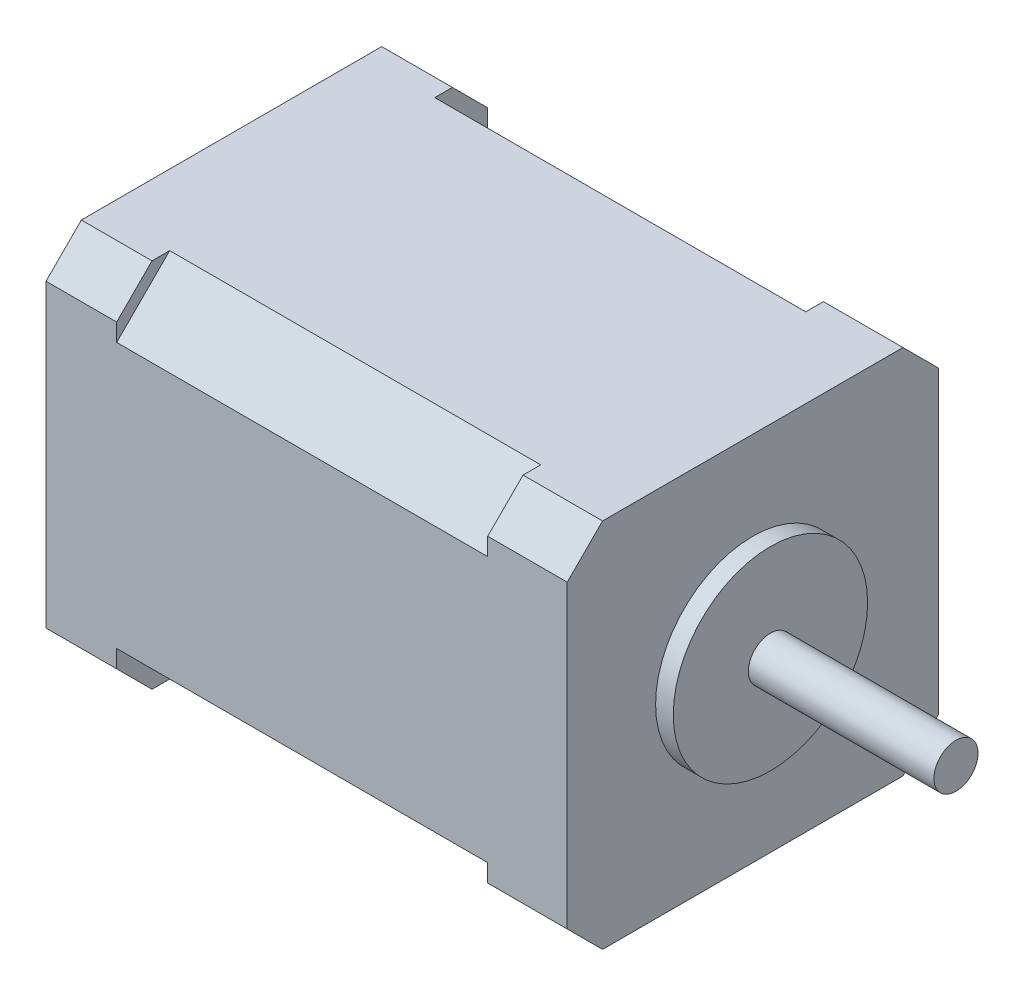
ISO-10303-21;
HEADER;
FILE_DESCRIPTION(('STEP AP214'),'2;1');
FILE_NAME('part.step','',(''),(''),'','','');
FILE_SCHEMA(('AUTOMOTIVE_DESIGN { 1 0 10303 214 1 1 1 1 }'));
ENDSEC;
DATA;
#1=APPLICATION_CONTEXT('core data for automotive mechanical design processes');
#2=APPLICATION_PROTOCOL_DEFINITION('international standard','automotive_design',2000,#1);
#3=PRODUCT_CONTEXT('',#1,'mechanical');
#4=PRODUCT('Part','Part','',(#3));
#5=PRODUCT_RELATED_PRODUCT_CATEGORY('part','',(#4));
#6=PRODUCT_DEFINITION_FORMATION('','',#4);
#7=PRODUCT_DEFINITION_CONTEXT('part definition',#1,'design');
#8=PRODUCT_DEFINITION('design','',#6,#7);
#9=PRODUCT_DEFINITION_SHAPE('','',#8);
#10=(LENGTH_UNIT() NAMED_UNIT(*) SI_UNIT(.MILLI.,.METRE.));
#11=(NAMED_UNIT(*) PLANE_ANGLE_UNIT() SI_UNIT($,.RADIAN.));
#12=(NAMED_UNIT(*) SI_UNIT($,.STERADIAN.) SOLID_ANGLE_UNIT());
#13=UNCERTAINTY_MEASURE_WITH_UNIT(LENGTH_MEASURE(1.E-05),#10,'distance_accuracy_value','');
#14=(GEOMETRIC_REPRESENTATION_CONTEXT(3) GLOBAL_UNCERTAINTY_ASSIGNED_CONTEXT((#13)) GLOBAL_UNIT_ASSIGNED_CONTEXT((#10,
#11,#12)) REPRESENTATION_CONTEXT('',''));
#15=CARTESIAN_POINT('',(0.,0.,0.));
#16=DIRECTION('',(0.,0.,1.));
#17=DIRECTION('',(1.,0.,0.));
#18=AXIS2_PLACEMENT_3D('',#15,#16,#17);
#19=CARTESIAN_POINT('',(59.,21.,21.));
#20=DIRECTION('',(0.,0.,-1.));
#21=DIRECTION('',(-1.,0.,0.));
#22=AXIS2_PLACEMENT_3D('',#19,#20,#21);
#23=PLANE('',#22);
#24=DIRECTION('',(0.,1.,0.));
#25=VECTOR('',#24,1.);
#26=CARTESIAN_POINT('',(50.,-21.,21.));
#27=LINE('',#26,#25);
#28=CARTESIAN_POINT('',(50.,-17.,21.));
#29=VERTEX_POINT('',#28);
#30=CARTESIAN_POINT('',(50.,-15.,21.));
#31=VERTEX_POINT('',#30);
#32=EDGE_CURVE('E282',#29,#31,#27,.T.);
#33=ORIENTED_EDGE('',*,*,#32,.F.);
#34=DIRECTION('',(1.,0.,0.));
#35=VECTOR('',#34,1.);
#36=CARTESIAN_POINT('',(59.,-17.,21.));
#37=LINE('',#36,#35);
#38=CARTESIAN_POINT('',(59.,-17.,21.));
#39=VERTEX_POINT('',#38);
#40=EDGE_CURVE('E460',#29,#39,#37,.T.);
#41=ORIENTED_EDGE('',*,*,#40,.T.);
#42=DIRECTION('',(0.,-1.,0.));
#43=VECTOR('',#42,1.);
#44=CARTESIAN_POINT('',(59.,21.,21.));
#45=LINE('',#44,#43);
#46=CARTESIAN_POINT('',(59.,17.,21.));
#47=VERTEX_POINT('',#46);
#48=EDGE_CURVE('E363',#47,#39,#45,.T.);
#49=ORIENTED_EDGE('',*,*,#48,.F.);
#50=DIRECTION('',(-1.,0.,0.));
#51=VECTOR('',#50,1.);
#52=CARTESIAN_POINT('',(59.,17.,21.));
#53=LINE('',#52,#51);
#54=CARTESIAN_POINT('',(50.,17.,21.));
#55=VERTEX_POINT('',#54);
#56=EDGE_CURVE('E449',#47,#55,#53,.T.);
#57=ORIENTED_EDGE('',*,*,#56,.T.);
#58=DIRECTION('',(0.,1.,0.));
#59=VECTOR('',#58,1.);
#60=CARTESIAN_POINT('',(50.,21.,21.));
#61=LINE('',#60,#59);
#62=CARTESIAN_POINT('',(50.,15.,21.));
#63=VERTEX_POINT('',#62);
#64=EDGE_CURVE('E316',#63,#55,#61,.T.);
#65=ORIENTED_EDGE('',*,*,#64,.F.);
#66=DIRECTION('',(-1.,0.,0.));
#67=VECTOR('',#66,1.);
#68=CARTESIAN_POINT('',(50.,15.,21.));
#69=LINE('',#68,#67);
#70=CARTESIAN_POINT('',(8.,15.,21.));
#71=VERTEX_POINT('',#70);
#72=EDGE_CURVE('E337',#63,#71,#69,.T.);
#73=ORIENTED_EDGE('',*,*,#72,.T.);
#74=DIRECTION('',(0.,1.,0.));
#75=VECTOR('',#74,1.);
#76=CARTESIAN_POINT('',(8.,21.,21.));
#77=LINE('',#76,#75);
#78=CARTESIAN_POINT('',(8.,17.,21.));
#79=VERTEX_POINT('',#78);
#80=EDGE_CURVE('E278',#71,#79,#77,.T.);
#81=ORIENTED_EDGE('',*,*,#80,.T.);
#82=DIRECTION('',(-1.,0.,0.));
#83=VECTOR('',#82,1.);
#84=CARTESIAN_POINT('',(59.,17.,21.));
#85=LINE('',#84,#83);
#86=CARTESIAN_POINT('',(0.,17.,21.));
#87=VERTEX_POINT('',#86);
#88=EDGE_CURVE('E453',#79,#87,#85,.T.);
#89=ORIENTED_EDGE('',*,*,#88,.T.);
#90=DIRECTION('',(0.,-1.,0.));
#91=VECTOR('',#90,1.);
#92=CARTESIAN_POINT('',(0.,21.,21.));
#93=LINE('',#92,#91);
#94=CARTESIAN_POINT('',(0.,-17.,21.));
#95=VERTEX_POINT('',#94);
#96=EDGE_CURVE('E358',#87,#95,#93,.T.);
#97=ORIENTED_EDGE('',*,*,#96,.T.);
#98=DIRECTION('',(1.,0.,0.));
#99=VECTOR('',#98,1.);
#100=CARTESIAN_POINT('',(59.,-17.,21.));
#101=LINE('',#100,#99);
#102=CARTESIAN_POINT('',(8.,-17.,21.));
#103=VERTEX_POINT('',#102);
#104=EDGE_CURVE('E457',#95,#103,#101,.T.);
#105=ORIENTED_EDGE('',*,*,#104,.T.);
#106=DIRECTION('',(0.,1.,0.));
#107=VECTOR('',#106,1.);
#108=CARTESIAN_POINT('',(8.,-21.,21.));
#109=LINE('',#108,#107);
#110=CARTESIAN_POINT('',(8.,-15.,21.));
#111=VERTEX_POINT('',#110);
#112=EDGE_CURVE('E270',#103,#111,#109,.T.);
#113=ORIENTED_EDGE('',*,*,#112,.T.);
#114=DIRECTION('',(-1.,0.,0.));
#115=VECTOR('',#114,1.);
#116=CARTESIAN_POINT('',(50.,-15.,21.));
#117=LINE('',#116,#115);
#118=EDGE_CURVE('E256',#31,#111,#117,.T.);
#119=ORIENTED_EDGE('',*,*,#118,.F.);
#120=EDGE_LOOP('',(#33,#41,#49,#57,#65,#73,#81,#89,#97,#105,#113,#119));
#121=FACE_BOUND('',#120,.T.);
#122=ADVANCED_FACE('F49',(#121),#23,.F.);
#123=CARTESIAN_POINT('',(59.,-21.,21.));
#124=DIRECTION('',(0.,1.,0.));
#125=DIRECTION('',(0.,0.,1.));
#126=AXIS2_PLACEMENT_3D('',#123,#124,#125);
#127=PLANE('',#126);
#128=DIRECTION('',(0.,0.,-1.));
#129=VECTOR('',#128,1.);
#130=CARTESIAN_POINT('',(0.,-21.,21.));
#131=LINE('',#130,#129);
#132=CARTESIAN_POINT('',(0.,-21.,17.));
#133=VERTEX_POINT('',#132);
#134=CARTESIAN_POINT('',(0.,-21.,-17.));
#135=VERTEX_POINT('',#134);
#136=EDGE_CURVE('E382',#133,#135,#131,.T.);
#137=ORIENTED_EDGE('',*,*,#136,.T.);
#138=DIRECTION('',(1.,0.,0.));
#139=VECTOR('',#138,1.);
#140=CARTESIAN_POINT('',(59.,-21.,-17.));
#141=LINE('',#140,#139);
#142=CARTESIAN_POINT('',(8.,-21.,-17.));
#143=VERTEX_POINT('',#142);
#144=EDGE_CURVE('E426',#135,#143,#141,.T.);
#145=ORIENTED_EDGE('',*,*,#144,.T.);
#146=DIRECTION('',(0.,0.,1.));
#147=VECTOR('',#146,1.);
#148=CARTESIAN_POINT('',(8.,-21.,-15.));
#149=LINE('',#148,#147);
#150=CARTESIAN_POINT('',(8.,-21.,-15.));
#151=VERTEX_POINT('',#150);
#152=EDGE_CURVE('E224',#143,#151,#149,.T.);
#153=ORIENTED_EDGE('',*,*,#152,.T.);
#154=DIRECTION('',(-1.,0.,0.));
#155=VECTOR('',#154,1.);
#156=CARTESIAN_POINT('',(50.,-21.,-15.));
#157=LINE('',#156,#155);
#158=CARTESIAN_POINT('',(50.,-21.,-15.));
#159=VERTEX_POINT('',#158);
#160=EDGE_CURVE('E233',#159,#151,#157,.T.);
#161=ORIENTED_EDGE('',*,*,#160,.F.);
#162=DIRECTION('',(0.,0.,1.));
#163=VECTOR('',#162,1.);
#164=CARTESIAN_POINT('',(50.,-21.,-15.));
#165=LINE('',#164,#163);
#166=CARTESIAN_POINT('',(50.,-21.,-17.));
#167=VERTEX_POINT('',#166);
#168=EDGE_CURVE('E251',#167,#159,#165,.T.);
#169=ORIENTED_EDGE('',*,*,#168,.F.);
#170=DIRECTION('',(1.,0.,0.));
#171=VECTOR('',#170,1.);
#172=CARTESIAN_POINT('',(59.,-21.,-17.));
#173=LINE('',#172,#171);
#174=CARTESIAN_POINT('',(59.,-21.,-17.));
#175=VERTEX_POINT('',#174);
#176=EDGE_CURVE('E423',#167,#175,#173,.T.);
#177=ORIENTED_EDGE('',*,*,#176,.T.);
#178=DIRECTION('',(0.,0.,-1.));
#179=VECTOR('',#178,1.);
#180=CARTESIAN_POINT('',(59.,-21.,21.));
#181=LINE('',#180,#179);
#182=CARTESIAN_POINT('',(59.,-21.,17.));
#183=VERTEX_POINT('',#182);
#184=EDGE_CURVE('E367',#183,#175,#181,.T.);
#185=ORIENTED_EDGE('',*,*,#184,.F.);
#186=DIRECTION('',(-1.,0.,0.));
#187=VECTOR('',#186,1.);
#188=CARTESIAN_POINT('',(59.,-21.,17.));
#189=LINE('',#188,#187);
#190=CARTESIAN_POINT('',(50.,-21.,17.));
#191=VERTEX_POINT('',#190);
#192=EDGE_CURVE('E419',#183,#191,#189,.T.);
#193=ORIENTED_EDGE('',*,*,#192,.T.);
#194=DIRECTION('',(0.,0.,1.));
#195=VECTOR('',#194,1.);
#196=CARTESIAN_POINT('',(50.,-21.,15.));
#197=LINE('',#196,#195);
#198=CARTESIAN_POINT('',(50.,-21.,15.));
#199=VERTEX_POINT('',#198);
#200=EDGE_CURVE('E271',#199,#191,#197,.T.);
#201=ORIENTED_EDGE('',*,*,#200,.F.);
#202=DIRECTION('',(-1.,0.,0.));
#203=VECTOR('',#202,1.);
#204=CARTESIAN_POINT('',(50.,-21.,15.));
#205=LINE('',#204,#203);
#206=CARTESIAN_POINT('',(8.,-21.,15.));
#207=VERTEX_POINT('',#206);
#208=EDGE_CURVE('E261',#199,#207,#205,.T.);
#209=ORIENTED_EDGE('',*,*,#208,.T.);
#210=DIRECTION('',(0.,0.,1.));
#211=VECTOR('',#210,1.);
#212=CARTESIAN_POINT('',(8.,-21.,15.));
#213=LINE('',#212,#211);
#214=CARTESIAN_POINT('',(8.,-21.,17.));
#215=VERTEX_POINT('',#214);
#216=EDGE_CURVE('E274',#207,#215,#213,.T.);
#217=ORIENTED_EDGE('',*,*,#216,.T.);
#218=DIRECTION('',(-1.,0.,0.));
#219=VECTOR('',#218,1.);
#220=CARTESIAN_POINT('',(59.,-21.,17.));
#221=LINE('',#220,#219);
#222=EDGE_CURVE('E415',#215,#133,#221,.T.);
#223=ORIENTED_EDGE('',*,*,#222,.T.);
#224=EDGE_LOOP('',(#137,#145,#153,#161,#169,#177,#185,#193,#201,#209,#217,#223));
#225=FACE_BOUND('',#224,.T.);
#226=ADVANCED_FACE('F519',(#225),#127,.F.);
#227=CARTESIAN_POINT('',(59.,21.,-21.));
#228=DIRECTION('',(0.,0.,1.));
#229=DIRECTION('',(0.,-1.,0.));
#230=AXIS2_PLACEMENT_3D('',#227,#228,#229);
#231=PLANE('',#230);
#232=DIRECTION('',(0.,-1.,0.));
#233=VECTOR('',#232,1.);
#234=CARTESIAN_POINT('',(8.,-21.,-21.));
#235=LINE('',#234,#233);
#236=CARTESIAN_POINT('',(8.,-15.,-21.));
#237=VERTEX_POINT('',#236);
#238=CARTESIAN_POINT('',(8.,-17.,-21.));
#239=VERTEX_POINT('',#238);
#240=EDGE_CURVE('E211',#237,#239,#235,.T.);
#241=ORIENTED_EDGE('',*,*,#240,.T.);
#242=DIRECTION('',(-1.,0.,0.));
#243=VECTOR('',#242,1.);
#244=CARTESIAN_POINT('',(59.,-17.,-21.));
#245=LINE('',#244,#243);
#246=CARTESIAN_POINT('',(0.,-17.,-21.));
#247=VERTEX_POINT('',#246);
#248=EDGE_CURVE('E400',#239,#247,#245,.T.);
#249=ORIENTED_EDGE('',*,*,#248,.T.);
#250=DIRECTION('',(0.,1.,0.));
#251=VECTOR('',#250,1.);
#252=CARTESIAN_POINT('',(0.,21.,-21.));
#253=LINE('',#252,#251);
#254=CARTESIAN_POINT('',(0.,17.,-21.));
#255=VERTEX_POINT('',#254);
#256=EDGE_CURVE('E386',#247,#255,#253,.T.);
#257=ORIENTED_EDGE('',*,*,#256,.T.);
#258=DIRECTION('',(1.,0.,0.));
#259=VECTOR('',#258,1.);
#260=CARTESIAN_POINT('',(59.,17.,-21.));
#261=LINE('',#260,#259);
#262=CARTESIAN_POINT('',(8.,17.,-21.));
#263=VERTEX_POINT('',#262);
#264=EDGE_CURVE('E394',#255,#263,#261,.T.);
#265=ORIENTED_EDGE('',*,*,#264,.T.);
#266=DIRECTION('',(0.,-1.,0.));
#267=VECTOR('',#266,1.);
#268=CARTESIAN_POINT('',(8.,21.,-21.));
#269=LINE('',#268,#267);
#270=CARTESIAN_POINT('',(8.,15.,-21.));
#271=VERTEX_POINT('',#270);
#272=EDGE_CURVE('E300',#263,#271,#269,.T.);
#273=ORIENTED_EDGE('',*,*,#272,.T.);
#274=DIRECTION('',(-1.,0.,0.));
#275=VECTOR('',#274,1.);
#276=CARTESIAN_POINT('',(50.,15.,-21.));
#277=LINE('',#276,#275);
#278=CARTESIAN_POINT('',(50.,15.,-21.));
#279=VERTEX_POINT('',#278);
#280=EDGE_CURVE('E288',#279,#271,#277,.T.);
#281=ORIENTED_EDGE('',*,*,#280,.F.);
#282=DIRECTION('',(0.,-1.,0.));
#283=VECTOR('',#282,1.);
#284=CARTESIAN_POINT('',(50.,21.,-21.));
#285=LINE('',#284,#283);
#286=CARTESIAN_POINT('',(50.,17.,-21.));
#287=VERTEX_POINT('',#286);
#288=EDGE_CURVE('E310',#287,#279,#285,.T.);
#289=ORIENTED_EDGE('',*,*,#288,.F.);
#290=DIRECTION('',(1.,0.,0.));
#291=VECTOR('',#290,1.);
#292=CARTESIAN_POINT('',(59.,17.,-21.));
#293=LINE('',#292,#291);
#294=CARTESIAN_POINT('',(59.,17.,-21.));
#295=VERTEX_POINT('',#294);
#296=EDGE_CURVE('E353',#287,#295,#293,.T.);
#297=ORIENTED_EDGE('',*,*,#296,.T.);
#298=DIRECTION('',(0.,1.,0.));
#299=VECTOR('',#298,1.);
#300=CARTESIAN_POINT('',(59.,21.,-21.));
#301=LINE('',#300,#299);
#302=CARTESIAN_POINT('',(59.,-17.,-21.));
#303=VERTEX_POINT('',#302);
#304=EDGE_CURVE('E372',#303,#295,#301,.T.);
#305=ORIENTED_EDGE('',*,*,#304,.F.);
#306=DIRECTION('',(-1.,0.,0.));
#307=VECTOR('',#306,1.);
#308=CARTESIAN_POINT('',(59.,-17.,-21.));
#309=LINE('',#308,#307);
#310=CARTESIAN_POINT('',(50.,-17.,-21.));
#311=VERTEX_POINT('',#310);
#312=EDGE_CURVE('E397',#303,#311,#309,.T.);
#313=ORIENTED_EDGE('',*,*,#312,.T.);
#314=DIRECTION('',(0.,-1.,0.));
#315=VECTOR('',#314,1.);
#316=CARTESIAN_POINT('',(50.,-21.,-21.));
#317=LINE('',#316,#315);
#318=CARTESIAN_POINT('',(50.,-15.,-21.));
#319=VERTEX_POINT('',#318);
#320=EDGE_CURVE('E235',#319,#311,#317,.T.);
#321=ORIENTED_EDGE('',*,*,#320,.F.);
#322=DIRECTION('',(-1.,0.,0.));
#323=VECTOR('',#322,1.);
#324=CARTESIAN_POINT('',(50.,-15.,-21.));
#325=LINE('',#324,#323);
#326=EDGE_CURVE('E230',#319,#237,#325,.T.);
#327=ORIENTED_EDGE('',*,*,#326,.T.);
#328=EDGE_LOOP('',(#241,#249,#257,#265,#273,#281,#289,#297,#305,#313,#321,#327));
#329=FACE_BOUND('',#328,.T.);
#330=ADVANCED_FACE('F238',(#329),#231,.F.);
#331=CARTESIAN_POINT('',(59.,21.,21.));
#332=DIRECTION('',(0.,-1.,0.));
#333=DIRECTION('',(0.,0.,-1.));
#334=AXIS2_PLACEMENT_3D('',#331,#332,#333);
#335=PLANE('',#334);
#336=DIRECTION('',(0.,0.,1.));
#337=VECTOR('',#336,1.);
#338=CARTESIAN_POINT('',(0.,21.,21.));
#339=LINE('',#338,#337);
#340=CARTESIAN_POINT('',(0.,21.,-17.));
#341=VERTEX_POINT('',#340);
#342=CARTESIAN_POINT('',(0.,21.,17.));
#343=VERTEX_POINT('',#342);
#344=EDGE_CURVE('E368',#341,#343,#339,.T.);
#345=ORIENTED_EDGE('',*,*,#344,.T.);
#346=DIRECTION('',(1.,0.,0.));
#347=VECTOR('',#346,1.);
#348=CARTESIAN_POINT('',(59.,21.,17.));
#349=LINE('',#348,#347);
#350=CARTESIAN_POINT('',(8.,21.,17.));
#351=VERTEX_POINT('',#350);
#352=EDGE_CURVE('E72',#343,#351,#349,.T.);
#353=ORIENTED_EDGE('',*,*,#352,.T.);
#354=DIRECTION('',(0.,0.,-1.));
#355=VECTOR('',#354,1.);
#356=CARTESIAN_POINT('',(8.,21.,15.));
#357=LINE('',#356,#355);
#358=CARTESIAN_POINT('',(8.,21.,15.));
#359=VERTEX_POINT('',#358);
#360=EDGE_CURVE('E331',#351,#359,#357,.T.);
#361=ORIENTED_EDGE('',*,*,#360,.T.);
#362=DIRECTION('',(-1.,0.,0.));
#363=VECTOR('',#362,1.);
#364=CARTESIAN_POINT('',(50.,21.,15.));
#365=LINE('',#364,#363);
#366=CARTESIAN_POINT('',(50.,21.,15.));
#367=VERTEX_POINT('',#366);
#368=EDGE_CURVE('E327',#367,#359,#365,.T.);
#369=ORIENTED_EDGE('',*,*,#368,.F.);
#370=DIRECTION('',(0.,0.,-1.));
#371=VECTOR('',#370,1.);
#372=CARTESIAN_POINT('',(50.,21.,15.));
#373=LINE('',#372,#371);
#374=CARTESIAN_POINT('',(50.,21.,17.));
#375=VERTEX_POINT('',#374);
#376=EDGE_CURVE('E319',#375,#367,#373,.T.);
#377=ORIENTED_EDGE('',*,*,#376,.F.);
#378=DIRECTION('',(1.,0.,0.));
#379=VECTOR('',#378,1.);
#380=CARTESIAN_POINT('',(59.,21.,17.));
#381=LINE('',#380,#379);
#382=CARTESIAN_POINT('',(59.,21.,17.));
#383=VERTEX_POINT('',#382);
#384=EDGE_CURVE('E466',#375,#383,#381,.T.);
#385=ORIENTED_EDGE('',*,*,#384,.T.);
#386=DIRECTION('',(0.,0.,1.));
#387=VECTOR('',#386,1.);
#388=CARTESIAN_POINT('',(59.,21.,21.));
#389=LINE('',#388,#387);
#390=CARTESIAN_POINT('',(59.,21.,-17.));
#391=VERTEX_POINT('',#390);
#392=EDGE_CURVE('E362',#391,#383,#389,.T.);
#393=ORIENTED_EDGE('',*,*,#392,.F.);
#394=DIRECTION('',(-1.,0.,0.));
#395=VECTOR('',#394,1.);
#396=CARTESIAN_POINT('',(59.,21.,-17.));
#397=LINE('',#396,#395);
#398=CARTESIAN_POINT('',(50.,21.,-17.));
#399=VERTEX_POINT('',#398);
#400=EDGE_CURVE('E469',#391,#399,#397,.T.);
#401=ORIENTED_EDGE('',*,*,#400,.T.);
#402=DIRECTION('',(0.,0.,-1.));
#403=VECTOR('',#402,1.);
#404=CARTESIAN_POINT('',(50.,21.,-15.));
#405=LINE('',#404,#403);
#406=CARTESIAN_POINT('',(50.,21.,-15.));
#407=VERTEX_POINT('',#406);
#408=EDGE_CURVE('E301',#407,#399,#405,.T.);
#409=ORIENTED_EDGE('',*,*,#408,.F.);
#410=DIRECTION('',(-1.,0.,0.));
#411=VECTOR('',#410,1.);
#412=CARTESIAN_POINT('',(50.,21.,-15.));
#413=LINE('',#412,#411);
#414=CARTESIAN_POINT('',(8.,21.,-15.));
#415=VERTEX_POINT('',#414);
#416=EDGE_CURVE('E223',#407,#415,#413,.T.);
#417=ORIENTED_EDGE('',*,*,#416,.T.);
#418=DIRECTION('',(0.,0.,-1.));
#419=VECTOR('',#418,1.);
#420=CARTESIAN_POINT('',(8.,21.,-15.));
#421=LINE('',#420,#419);
#422=CARTESIAN_POINT('',(8.,21.,-17.));
#423=VERTEX_POINT('',#422);
#424=EDGE_CURVE('E265',#415,#423,#421,.T.);
#425=ORIENTED_EDGE('',*,*,#424,.T.);
#426=DIRECTION('',(-1.,0.,0.));
#427=VECTOR('',#426,1.);
#428=CARTESIAN_POINT('',(59.,21.,-17.));
#429=LINE('',#428,#427);
#430=EDGE_CURVE('E473',#423,#341,#429,.T.);
#431=ORIENTED_EDGE('',*,*,#430,.T.);
#432=EDGE_LOOP('',(#345,#353,#361,#369,#377,#385,#393,#401,#409,#417,#425,#431));
#433=FACE_BOUND('',#432,.T.);
#434=ADVANCED_FACE('F501',(#433),#335,.F.);
#435=CARTESIAN_POINT('',(59.,0.,0.));
#436=DIRECTION('',(1.,0.,0.));
#437=DIRECTION('',(0.,0.,-1.));
#438=AXIS2_PLACEMENT_3D('',#435,#436,#437);
#439=PLANE('',#438);
#440=CARTESIAN_POINT('',(59.,0.,0.));
#441=DIRECTION('',(1.,0.,0.));
#442=DIRECTION('',(0.,0.,-1.));
#443=AXIS2_PLACEMENT_3D('',#440,#441,#442);
#444=CIRCLE('',#443,11.);
#445=CARTESIAN_POINT('',(59.,0.,-11.));
#446=VERTEX_POINT('',#445);
#447=EDGE_CURVE('E354',#446,#446,#444,.T.);
#448=ORIENTED_EDGE('',*,*,#447,.F.);
#449=EDGE_LOOP('',(#448));
#450=FACE_BOUND('',#449,.T.);
#451=ORIENTED_EDGE('',*,*,#184,.T.);
#452=DIRECTION('',(0.,-0.707106781186547,0.707106781186548));
#453=VECTOR('',#452,1.);
#454=CARTESIAN_POINT('',(59.,-19.,-19.));
#455=LINE('',#454,#453);
#456=EDGE_CURVE('E443',#175,#303,#455,.F.);
#457=ORIENTED_EDGE('',*,*,#456,.T.);
#458=ORIENTED_EDGE('',*,*,#304,.T.);
#459=DIRECTION('',(0.,-0.707106781186548,-0.707106781186548));
#460=VECTOR('',#459,1.);
#461=CARTESIAN_POINT('',(59.,19.,-19.));
#462=LINE('',#461,#460);
#463=EDGE_CURVE('E437',#295,#391,#462,.F.);
#464=ORIENTED_EDGE('',*,*,#463,.T.);
#465=ORIENTED_EDGE('',*,*,#392,.T.);
#466=DIRECTION('',(0.,0.707106781186548,-0.707106781186548));
#467=VECTOR('',#466,1.);
#468=CARTESIAN_POINT('',(59.,19.,19.));
#469=LINE('',#468,#467);
#470=EDGE_CURVE('E434',#383,#47,#469,.F.);
#471=ORIENTED_EDGE('',*,*,#470,.T.);
#472=ORIENTED_EDGE('',*,*,#48,.T.);
#473=DIRECTION('',(0.,0.707106781186549,0.707106781186546));
#474=VECTOR('',#473,1.);
#475=CARTESIAN_POINT('',(59.,-19.,19.));
#476=LINE('',#475,#474);
#477=EDGE_CURVE('E440',#39,#183,#476,.F.);
#478=ORIENTED_EDGE('',*,*,#477,.T.);
#479=EDGE_LOOP('',(#451,#457,#458,#464,#465,#471,#472,#478));
#480=FACE_BOUND('',#479,.T.);
#481=ADVANCED_FACE('F499',(#450,#480),#439,.T.);
#482=CARTESIAN_POINT('',(0.,0.,0.));
#483=DIRECTION('',(1.,0.,0.));
#484=DIRECTION('',(0.,0.,-1.));
#485=AXIS2_PLACEMENT_3D('',#482,#483,#484);
#486=PLANE('',#485);
#487=ORIENTED_EDGE('',*,*,#256,.F.);
#488=DIRECTION('',(0.,0.707106781186547,-0.707106781186548));
#489=VECTOR('',#488,1.);
#490=CARTESIAN_POINT('',(0.,-17.,-21.));
#491=LINE('',#490,#489);
#492=EDGE_CURVE('E412',#247,#135,#491,.F.);
#493=ORIENTED_EDGE('',*,*,#492,.T.);
#494=ORIENTED_EDGE('',*,*,#136,.F.);
#495=DIRECTION('',(0.,-0.707106781186549,-0.707106781186546));
#496=VECTOR('',#495,1.);
#497=CARTESIAN_POINT('',(0.,-21.,17.));
#498=LINE('',#497,#496);
#499=EDGE_CURVE('E409',#133,#95,#498,.F.);
#500=ORIENTED_EDGE('',*,*,#499,.T.);
#501=ORIENTED_EDGE('',*,*,#96,.F.);
#502=DIRECTION('',(0.,-0.707106781186548,0.707106781186548));
#503=VECTOR('',#502,1.);
#504=CARTESIAN_POINT('',(0.,17.,21.));
#505=LINE('',#504,#503);
#506=EDGE_CURVE('E406',#87,#343,#505,.F.);
#507=ORIENTED_EDGE('',*,*,#506,.T.);
#508=ORIENTED_EDGE('',*,*,#344,.F.);
#509=DIRECTION('',(0.,0.707106781186548,0.707106781186548));
#510=VECTOR('',#509,1.);
#511=CARTESIAN_POINT('',(0.,21.,-17.));
#512=LINE('',#511,#510);
#513=EDGE_CURVE('E403',#341,#255,#512,.F.);
#514=ORIENTED_EDGE('',*,*,#513,.T.);
#515=EDGE_LOOP('',(#487,#493,#494,#500,#501,#507,#508,#514));
#516=FACE_BOUND('',#515,.T.);
#517=ADVANCED_FACE('F534',(#516),#486,.F.);
#518=CARTESIAN_POINT('',(61.,0.,0.));
#519=DIRECTION('',(-1.,0.,0.));
#520=DIRECTION('',(0.,0.,1.));
#521=AXIS2_PLACEMENT_3D('',#518,#519,#520);
#522=CYLINDRICAL_SURFACE('',#521,11.);
#523=CARTESIAN_POINT('',(61.,0.,0.));
#524=DIRECTION('',(1.,0.,0.));
#525=DIRECTION('',(0.,0.,-1.));
#526=AXIS2_PLACEMENT_3D('',#523,#524,#525);
#527=CIRCLE('',#526,11.);
#528=CARTESIAN_POINT('',(61.,0.,-11.));
#529=VERTEX_POINT('',#528);
#530=EDGE_CURVE('E348',#529,#529,#527,.T.);
#531=ORIENTED_EDGE('',*,*,#530,.F.);
#532=EDGE_LOOP('',(#531));
#533=FACE_BOUND('',#532,.T.);
#534=ORIENTED_EDGE('',*,*,#447,.T.);
#535=EDGE_LOOP('',(#534));
#536=FACE_BOUND('',#535,.T.);
#537=ADVANCED_FACE('F802',(#533,#536),#522,.T.);
#538=CARTESIAN_POINT('',(61.,0.,0.));
#539=DIRECTION('',(1.,0.,0.));
#540=DIRECTION('',(0.,0.,-1.));
#541=AXIS2_PLACEMENT_3D('',#538,#539,#540);
#542=PLANE('',#541);
#543=CARTESIAN_POINT('',(61.,0.,0.));
#544=DIRECTION('',(1.,0.,0.));
#545=DIRECTION('',(0.,0.,-1.));
#546=AXIS2_PLACEMENT_3D('',#543,#544,#545);
#547=CIRCLE('',#546,2.5);
#548=CARTESIAN_POINT('',(61.,0.,2.5));
#549=VERTEX_POINT('',#548);
#550=EDGE_CURVE('E349',#549,#549,#547,.T.);
#551=ORIENTED_EDGE('',*,*,#550,.F.);
#552=EDGE_LOOP('',(#551));
#553=FACE_BOUND('',#552,.T.);
#554=ORIENTED_EDGE('',*,*,#530,.T.);
#555=EDGE_LOOP('',(#554));
#556=FACE_BOUND('',#555,.T.);
#557=ADVANCED_FACE('F792',(#553,#556),#542,.T.);
#558=CARTESIAN_POINT('',(82.,0.,0.));
#559=DIRECTION('',(-1.,0.,0.));
#560=DIRECTION('',(0.,0.,1.));
#561=AXIS2_PLACEMENT_3D('',#558,#559,#560);
#562=CYLINDRICAL_SURFACE('',#561,2.5);
#563=CARTESIAN_POINT('',(82.,0.,0.));
#564=DIRECTION('',(1.,0.,0.));
#565=DIRECTION('',(0.,0.,-1.));
#566=AXIS2_PLACEMENT_3D('',#563,#564,#565);
#567=CIRCLE('',#566,2.5);
#568=CARTESIAN_POINT('',(82.,0.,2.5));
#569=VERTEX_POINT('',#568);
#570=EDGE_CURVE('E341',#569,#569,#567,.T.);
#571=CARTESIAN_POINT('',(82.,0.,2.5));
#572=CARTESIAN_POINT('',(81.78125,0.,2.5));
#573=CARTESIAN_POINT('',(81.5625,0.,2.5));
#574=CARTESIAN_POINT('',(81.125,0.,2.5));
#575=CARTESIAN_POINT('',(80.90625,0.,2.5));
#576=CARTESIAN_POINT('',(80.46875,0.,2.5));
#577=CARTESIAN_POINT('',(80.25,0.,2.5));
#578=CARTESIAN_POINT('',(79.8125,0.,2.5));
#579=CARTESIAN_POINT('',(79.59375,0.,2.5));
#580=CARTESIAN_POINT('',(79.15625,0.,2.5));
#581=CARTESIAN_POINT('',(78.9375,0.,2.5));
#582=CARTESIAN_POINT('',(78.5,0.,2.5));
#583=CARTESIAN_POINT('',(78.28125,0.,2.5));
#584=CARTESIAN_POINT('',(77.84375,0.,2.5));
#585=CARTESIAN_POINT('',(77.625,0.,2.5));
#586=CARTESIAN_POINT('',(77.1875,0.,2.5));
#587=CARTESIAN_POINT('',(76.96875,0.,2.5));
#588=CARTESIAN_POINT('',(76.53125,0.,2.5));
#589=CARTESIAN_POINT('',(76.3125,0.,2.5));
#590=CARTESIAN_POINT('',(75.875,0.,2.5));
#591=CARTESIAN_POINT('',(75.65625,0.,2.5));
#592=CARTESIAN_POINT('',(75.21875,0.,2.5));
#593=CARTESIAN_POINT('',(75.,0.,2.5));
#594=CARTESIAN_POINT('',(74.5625,0.,2.5));
#595=CARTESIAN_POINT('',(74.34375,0.,2.5));
#596=CARTESIAN_POINT('',(73.90625,0.,2.5));
#597=CARTESIAN_POINT('',(73.6875,0.,2.5));
#598=CARTESIAN_POINT('',(73.25,0.,2.5));
#599=CARTESIAN_POINT('',(73.03125,0.,2.5));
#600=CARTESIAN_POINT('',(72.59375,0.,2.5));
#601=CARTESIAN_POINT('',(72.375,0.,2.5));
#602=CARTESIAN_POINT('',(71.9375,0.,2.5));
#603=CARTESIAN_POINT('',(71.71875,0.,2.5));
#604=CARTESIAN_POINT('',(71.28125,0.,2.5));
#605=CARTESIAN_POINT('',(71.0625,0.,2.5));
#606=CARTESIAN_POINT('',(70.625,0.,2.5));
#607=CARTESIAN_POINT('',(70.40625,0.,2.5));
#608=CARTESIAN_POINT('',(69.96875,0.,2.5));
#609=CARTESIAN_POINT('',(69.75,0.,2.5));
#610=CARTESIAN_POINT('',(69.3125,0.,2.5));
#611=CARTESIAN_POINT('',(69.09375,0.,2.5));
#612=CARTESIAN_POINT('',(68.65625,0.,2.5));
#613=CARTESIAN_POINT('',(68.4375,0.,2.5));
#614=CARTESIAN_POINT('',(68.,0.,2.5));
#615=CARTESIAN_POINT('',(67.78125,0.,2.5));
#616=CARTESIAN_POINT('',(67.34375,0.,2.5));
#617=CARTESIAN_POINT('',(67.125,0.,2.5));
#618=CARTESIAN_POINT('',(66.6875,0.,2.5));
#619=CARTESIAN_POINT('',(66.46875,0.,2.5));
#620=CARTESIAN_POINT('',(66.03125,0.,2.5));
#621=CARTESIAN_POINT('',(65.8125,0.,2.5));
#622=CARTESIAN_POINT('',(65.375,0.,2.5));
#623=CARTESIAN_POINT('',(65.15625,0.,2.5));
#624=CARTESIAN_POINT('',(64.71875,0.,2.5));
#625=CARTESIAN_POINT('',(64.5,0.,2.5));
#626=CARTESIAN_POINT('',(64.0625,0.,2.5));
#627=CARTESIAN_POINT('',(63.84375,0.,2.5));
#628=CARTESIAN_POINT('',(63.40625,0.,2.5));
#629=CARTESIAN_POINT('',(63.1875,0.,2.5));
#630=CARTESIAN_POINT('',(62.75,0.,2.5));
#631=CARTESIAN_POINT('',(62.53125,0.,2.5));
#632=CARTESIAN_POINT('',(62.09375,0.,2.5));
#633=CARTESIAN_POINT('',(61.875,0.,2.5));
#634=CARTESIAN_POINT('',(61.4375,0.,2.5));
#635=CARTESIAN_POINT('',(61.21875,0.,2.5));
#636=CARTESIAN_POINT('',(61.,0.,2.5));
#637=B_SPLINE_CURVE_WITH_KNOTS('',3,(#571,#572,#573,#574,#575,#576,#577,#578,#579,#580,#581,
#582,#583,#584,#585,#586,#587,#588,#589,#590,#591,#592,#593,#594,#595,#596,#597,#598,#599,#600,
#601,#602,#603,#604,#605,#606,#607,#608,#609,#610,#611,#612,#613,#614,#615,#616,#617,#618,#619,
#620,#621,#622,#623,#624,#625,#626,#627,#628,#629,#630,#631,#632,#633,#634,#635,#636),
.UNSPECIFIED.,.F.,.F.,(4,2,2,2,2,2,2,2,2,2,2,2,2,2,2,2,2,2,2,2,2,2,2,2,2,2,2,2,2,2,2,2,4),(0.,
0.656249999999997,1.31249999999999,1.96874999999999,2.62499999999999,3.28125,3.9375,
4.59374999999999,5.24999999999999,5.90624999999999,6.5625,7.21875,7.87499999999999,
8.53124999999999,9.18749999999999,9.84375,10.5,11.15625,11.8125,12.46875,13.125,13.78125,
14.4375,15.09375,15.75,16.40625,17.0625,17.71875,18.375,19.03125,19.6875,20.34375,21.),.UNSPECIFIED.);
#638=EDGE_CURVE('BSEAM782',#569,#549,#637,.T.);
#639=ORIENTED_EDGE('',*,*,#570,.F.);
#640=ORIENTED_EDGE('',*,*,#550,.T.);
#641=ORIENTED_EDGE('',*,*,#638,.T.);
#642=ORIENTED_EDGE('',*,*,#638,.F.);
#643=EDGE_LOOP('',(#639,#641,#640,#642));
#644=FACE_BOUND('',#643,.T.);
#645=ADVANCED_FACE('F782',(#644),#562,.T.);
#646=CARTESIAN_POINT('',(82.,0.,0.));
#647=DIRECTION('',(1.,0.,0.));
#648=DIRECTION('',(0.,0.,-1.));
#649=AXIS2_PLACEMENT_3D('',#646,#647,#648);
#650=PLANE('',#649);
#651=ORIENTED_EDGE('',*,*,#570,.T.);
#652=EDGE_LOOP('',(#651));
#653=FACE_BOUND('',#652,.T.);
#654=ADVANCED_FACE('F745',(#653),#650,.T.);
#655=CARTESIAN_POINT('',(50.,15.,21.));
#656=DIRECTION('',(0.,-0.707106781186547,-0.707106781186547));
#657=DIRECTION('',(0.,0.707106781186548,-0.707106781186548));
#658=AXIS2_PLACEMENT_3D('',#655,#656,#657);
#659=PLANE('',#658);
#660=DIRECTION('',(0.,-0.707106781186548,0.707106781186548));
#661=VECTOR('',#660,1.);
#662=CARTESIAN_POINT('',(8.,15.,21.));
#663=LINE('',#662,#661);
#664=EDGE_CURVE('E320',#359,#71,#663,.T.);
#665=ORIENTED_EDGE('',*,*,#664,.T.);
#666=ORIENTED_EDGE('',*,*,#72,.F.);
#667=DIRECTION('',(0.,-0.707106781186548,0.707106781186548));
#668=VECTOR('',#667,1.);
#669=CARTESIAN_POINT('',(50.,15.,21.));
#670=LINE('',#669,#668);
#671=EDGE_CURVE('E323',#367,#63,#670,.T.);
#672=ORIENTED_EDGE('',*,*,#671,.F.);
#673=ORIENTED_EDGE('',*,*,#368,.T.);
#674=EDGE_LOOP('',(#665,#666,#672,#673));
#675=FACE_BOUND('',#674,.T.);
#676=ADVANCED_FACE('F737',(#675),#659,.F.);
#677=CARTESIAN_POINT('',(50.,0.,0.));
#678=DIRECTION('',(-1.,0.,0.));
#679=DIRECTION('',(0.,0.,1.));
#680=AXIS2_PLACEMENT_3D('',#677,#678,#679);
#681=PLANE('',#680);
#682=ORIENTED_EDGE('',*,*,#64,.T.);
#683=DIRECTION('',(0.,-0.707106781186548,0.707106781186548));
#684=VECTOR('',#683,1.);
#685=CARTESIAN_POINT('',(50.,19.,19.));
#686=LINE('',#685,#684);
#687=EDGE_CURVE('E11',#55,#375,#686,.F.);
#688=ORIENTED_EDGE('',*,*,#687,.T.);
#689=ORIENTED_EDGE('',*,*,#376,.T.);
#690=ORIENTED_EDGE('',*,*,#671,.T.);
#691=EDGE_LOOP('',(#682,#688,#689,#690));
#692=FACE_BOUND('',#691,.T.);
#693=ADVANCED_FACE('F557',(#692),#681,.T.);
#694=CARTESIAN_POINT('',(8.,0.,0.));
#695=DIRECTION('',(-1.,0.,0.));
#696=DIRECTION('',(0.,0.,1.));
#697=AXIS2_PLACEMENT_3D('',#694,#695,#696);
#698=PLANE('',#697);
#699=ORIENTED_EDGE('',*,*,#360,.F.);
#700=DIRECTION('',(0.,0.707106781186548,-0.707106781186548));
#701=VECTOR('',#700,1.);
#702=CARTESIAN_POINT('',(8.,17.,21.));
#703=LINE('',#702,#701);
#704=EDGE_CURVE('E479',#351,#79,#703,.F.);
#705=ORIENTED_EDGE('',*,*,#704,.T.);
#706=ORIENTED_EDGE('',*,*,#80,.F.);
#707=ORIENTED_EDGE('',*,*,#664,.F.);
#708=EDGE_LOOP('',(#699,#705,#706,#707));
#709=FACE_BOUND('',#708,.T.);
#710=ADVANCED_FACE('F548',(#709),#698,.F.);
#711=CARTESIAN_POINT('',(50.,15.,-21.));
#712=DIRECTION('',(0.,-0.707106781186547,0.707106781186547));
#713=DIRECTION('',(0.,-0.707106781186548,-0.707106781186548));
#714=AXIS2_PLACEMENT_3D('',#711,#712,#713);
#715=PLANE('',#714);
#716=DIRECTION('',(0.,0.707106781186548,0.707106781186548));
#717=VECTOR('',#716,1.);
#718=CARTESIAN_POINT('',(8.,15.,-21.));
#719=LINE('',#718,#717);
#720=EDGE_CURVE('E296',#271,#415,#719,.T.);
#721=ORIENTED_EDGE('',*,*,#720,.T.);
#722=ORIENTED_EDGE('',*,*,#416,.F.);
#723=DIRECTION('',(0.,0.707106781186548,0.707106781186548));
#724=VECTOR('',#723,1.);
#725=CARTESIAN_POINT('',(50.,15.,-21.));
#726=LINE('',#725,#724);
#727=EDGE_CURVE('E292',#279,#407,#726,.T.);
#728=ORIENTED_EDGE('',*,*,#727,.F.);
#729=ORIENTED_EDGE('',*,*,#280,.T.);
#730=EDGE_LOOP('',(#721,#722,#728,#729));
#731=FACE_BOUND('',#730,.T.);
#732=ADVANCED_FACE('F546',(#731),#715,.F.);
#733=CARTESIAN_POINT('',(50.,0.,0.));
#734=DIRECTION('',(-1.,0.,0.));
#735=DIRECTION('',(0.,0.,1.));
#736=AXIS2_PLACEMENT_3D('',#733,#734,#735);
#737=PLANE('',#736);
#738=ORIENTED_EDGE('',*,*,#408,.T.);
#739=DIRECTION('',(0.,0.707106781186548,0.707106781186548));
#740=VECTOR('',#739,1.);
#741=CARTESIAN_POINT('',(50.,19.,-19.));
#742=LINE('',#741,#740);
#743=EDGE_CURVE('E59',#399,#287,#742,.F.);
#744=ORIENTED_EDGE('',*,*,#743,.T.);
#745=ORIENTED_EDGE('',*,*,#288,.T.);
#746=ORIENTED_EDGE('',*,*,#727,.T.);
#747=EDGE_LOOP('',(#738,#744,#745,#746));
#748=FACE_BOUND('',#747,.T.);
#749=ADVANCED_FACE('F487',(#748),#737,.T.);
#750=CARTESIAN_POINT('',(8.,0.,0.));
#751=DIRECTION('',(-1.,0.,0.));
#752=DIRECTION('',(0.,0.,1.));
#753=AXIS2_PLACEMENT_3D('',#750,#751,#752);
#754=PLANE('',#753);
#755=ORIENTED_EDGE('',*,*,#272,.F.);
#756=DIRECTION('',(0.,-0.707106781186548,-0.707106781186548));
#757=VECTOR('',#756,1.);
#758=CARTESIAN_POINT('',(8.,21.,-17.));
#759=LINE('',#758,#757);
#760=EDGE_CURVE('E482',#263,#423,#759,.F.);
#761=ORIENTED_EDGE('',*,*,#760,.T.);
#762=ORIENTED_EDGE('',*,*,#424,.F.);
#763=ORIENTED_EDGE('',*,*,#720,.F.);
#764=EDGE_LOOP('',(#755,#761,#762,#763));
#765=FACE_BOUND('',#764,.T.);
#766=ADVANCED_FACE('F544',(#765),#754,.F.);
#767=CARTESIAN_POINT('',(50.,-15.,-21.));
#768=DIRECTION('',(0.,0.707106781186547,0.707106781186547));
#769=DIRECTION('',(0.,-0.707106781186548,0.707106781186548));
#770=AXIS2_PLACEMENT_3D('',#767,#768,#769);
#771=PLANE('',#770);
#772=DIRECTION('',(0.,0.707106781186548,-0.707106781186548));
#773=VECTOR('',#772,1.);
#774=CARTESIAN_POINT('',(8.,-15.,-21.));
#775=LINE('',#774,#773);
#776=EDGE_CURVE('E215',#151,#237,#775,.T.);
#777=ORIENTED_EDGE('',*,*,#776,.T.);
#778=ORIENTED_EDGE('',*,*,#326,.F.);
#779=DIRECTION('',(0.,0.707106781186548,-0.707106781186548));
#780=VECTOR('',#779,1.);
#781=CARTESIAN_POINT('',(50.,-15.,-21.));
#782=LINE('',#781,#780);
#783=EDGE_CURVE('E244',#159,#319,#782,.T.);
#784=ORIENTED_EDGE('',*,*,#783,.F.);
#785=ORIENTED_EDGE('',*,*,#160,.T.);
#786=EDGE_LOOP('',(#777,#778,#784,#785));
#787=FACE_BOUND('',#786,.T.);
#788=ADVANCED_FACE('F228',(#787),#771,.F.);
#789=CARTESIAN_POINT('',(50.,0.,0.));
#790=DIRECTION('',(-1.,0.,0.));
#791=DIRECTION('',(0.,0.,1.));
#792=AXIS2_PLACEMENT_3D('',#789,#790,#791);
#793=PLANE('',#792);
#794=ORIENTED_EDGE('',*,*,#320,.T.);
#795=DIRECTION('',(0.,0.707106781186547,-0.707106781186548));
#796=VECTOR('',#795,1.);
#797=CARTESIAN_POINT('',(50.,-19.,-19.));
#798=LINE('',#797,#796);
#799=EDGE_CURVE('E431',#311,#167,#798,.F.);
#800=ORIENTED_EDGE('',*,*,#799,.T.);
#801=ORIENTED_EDGE('',*,*,#168,.T.);
#802=ORIENTED_EDGE('',*,*,#783,.T.);
#803=EDGE_LOOP('',(#794,#800,#801,#802));
#804=FACE_BOUND('',#803,.T.);
#805=ADVANCED_FACE('F527',(#804),#793,.T.);
#806=CARTESIAN_POINT('',(8.,0.,0.));
#807=DIRECTION('',(-1.,0.,0.));
#808=DIRECTION('',(0.,0.,1.));
#809=AXIS2_PLACEMENT_3D('',#806,#807,#808);
#810=PLANE('',#809);
#811=ORIENTED_EDGE('',*,*,#152,.F.);
#812=DIRECTION('',(0.,-0.707106781186547,0.707106781186548));
#813=VECTOR('',#812,1.);
#814=CARTESIAN_POINT('',(8.,-17.,-21.));
#815=LINE('',#814,#813);
#816=EDGE_CURVE('E217',#143,#239,#815,.F.);
#817=ORIENTED_EDGE('',*,*,#816,.T.);
#818=ORIENTED_EDGE('',*,*,#240,.F.);
#819=ORIENTED_EDGE('',*,*,#776,.F.);
#820=EDGE_LOOP('',(#811,#817,#818,#819));
#821=FACE_BOUND('',#820,.T.);
#822=ADVANCED_FACE('F214',(#821),#810,.F.);
#823=CARTESIAN_POINT('',(50.,-15.,21.));
#824=DIRECTION('',(0.,0.707106781186547,-0.707106781186547));
#825=DIRECTION('',(0.,0.707106781186548,0.707106781186548));
#826=AXIS2_PLACEMENT_3D('',#823,#824,#825);
#827=PLANE('',#826);
#828=DIRECTION('',(0.,-0.707106781186548,-0.707106781186548));
#829=VECTOR('',#828,1.);
#830=CARTESIAN_POINT('',(8.,-15.,21.));
#831=LINE('',#830,#829);
#832=EDGE_CURVE('E266',#111,#207,#831,.T.);
#833=ORIENTED_EDGE('',*,*,#832,.T.);
#834=ORIENTED_EDGE('',*,*,#208,.F.);
#835=DIRECTION('',(0.,-0.707106781186548,-0.707106781186548));
#836=VECTOR('',#835,1.);
#837=CARTESIAN_POINT('',(50.,-15.,21.));
#838=LINE('',#837,#836);
#839=EDGE_CURVE('E260',#31,#199,#838,.T.);
#840=ORIENTED_EDGE('',*,*,#839,.F.);
#841=ORIENTED_EDGE('',*,*,#118,.T.);
#842=EDGE_LOOP('',(#833,#834,#840,#841));
#843=FACE_BOUND('',#842,.T.);
#844=ADVANCED_FACE('F674',(#843),#827,.F.);
#845=CARTESIAN_POINT('',(50.,0.,0.));
#846=DIRECTION('',(-1.,0.,0.));
#847=DIRECTION('',(0.,0.,1.));
#848=AXIS2_PLACEMENT_3D('',#845,#846,#847);
#849=PLANE('',#848);
#850=ORIENTED_EDGE('',*,*,#200,.T.);
#851=DIRECTION('',(0.,-0.707106781186549,-0.707106781186546));
#852=VECTOR('',#851,1.);
#853=CARTESIAN_POINT('',(50.,-19.,19.));
#854=LINE('',#853,#852);
#855=EDGE_CURVE('E446',#191,#29,#854,.F.);
#856=ORIENTED_EDGE('',*,*,#855,.T.);
#857=ORIENTED_EDGE('',*,*,#32,.T.);
#858=ORIENTED_EDGE('',*,*,#839,.T.);
#859=EDGE_LOOP('',(#850,#856,#857,#858));
#860=FACE_BOUND('',#859,.T.);
#861=ADVANCED_FACE('F664',(#860),#849,.T.);
#862=CARTESIAN_POINT('',(8.,0.,0.));
#863=DIRECTION('',(-1.,0.,0.));
#864=DIRECTION('',(0.,0.,1.));
#865=AXIS2_PLACEMENT_3D('',#862,#863,#864);
#866=PLANE('',#865);
#867=ORIENTED_EDGE('',*,*,#112,.F.);
#868=DIRECTION('',(0.,0.707106781186549,0.707106781186546));
#869=VECTOR('',#868,1.);
#870=CARTESIAN_POINT('',(8.,-21.,17.));
#871=LINE('',#870,#869);
#872=EDGE_CURVE('E463',#103,#215,#871,.F.);
#873=ORIENTED_EDGE('',*,*,#872,.T.);
#874=ORIENTED_EDGE('',*,*,#216,.F.);
#875=ORIENTED_EDGE('',*,*,#832,.F.);
#876=EDGE_LOOP('',(#867,#873,#874,#875));
#877=FACE_BOUND('',#876,.T.);
#878=ADVANCED_FACE('F577',(#877),#866,.F.);
#879=CARTESIAN_POINT('',(59.,-17.,-21.));
#880=DIRECTION('',(0.,0.707106781186548,0.707106781186547));
#881=DIRECTION('',(-1.,0.,0.));
#882=AXIS2_PLACEMENT_3D('',#879,#880,#881);
#883=PLANE('',#882);
#884=ORIENTED_EDGE('',*,*,#816,.F.);
#885=ORIENTED_EDGE('',*,*,#144,.F.);
#886=ORIENTED_EDGE('',*,*,#492,.F.);
#887=ORIENTED_EDGE('',*,*,#248,.F.);
#888=EDGE_LOOP('',(#884,#885,#886,#887));
#889=FACE_BOUND('',#888,.T.);
#890=ADVANCED_FACE('F530',(#889),#883,.F.);
#891=CARTESIAN_POINT('',(59.,-17.,-21.));
#892=DIRECTION('',(0.,0.707106781186548,0.707106781186547));
#893=DIRECTION('',(-1.,0.,0.));
#894=AXIS2_PLACEMENT_3D('',#891,#892,#893);
#895=PLANE('',#894);
#896=ORIENTED_EDGE('',*,*,#456,.F.);
#897=ORIENTED_EDGE('',*,*,#176,.F.);
#898=ORIENTED_EDGE('',*,*,#799,.F.);
#899=ORIENTED_EDGE('',*,*,#312,.F.);
#900=EDGE_LOOP('',(#896,#897,#898,#899));
#901=FACE_BOUND('',#900,.T.);
#902=ADVANCED_FACE('F524',(#901),#895,.F.);
#903=CARTESIAN_POINT('',(59.,-21.,17.));
#904=DIRECTION('',(0.,0.707106781186546,-0.707106781186549));
#905=DIRECTION('',(-1.,0.,0.));
#906=AXIS2_PLACEMENT_3D('',#903,#904,#905);
#907=PLANE('',#906);
#908=ORIENTED_EDGE('',*,*,#477,.F.);
#909=ORIENTED_EDGE('',*,*,#40,.F.);
#910=ORIENTED_EDGE('',*,*,#855,.F.);
#911=ORIENTED_EDGE('',*,*,#192,.F.);
#912=EDGE_LOOP('',(#908,#909,#910,#911));
#913=FACE_BOUND('',#912,.T.);
#914=ADVANCED_FACE('F514',(#913),#907,.F.);
#915=CARTESIAN_POINT('',(59.,-21.,17.));
#916=DIRECTION('',(0.,0.707106781186546,-0.707106781186549));
#917=DIRECTION('',(-1.,0.,0.));
#918=AXIS2_PLACEMENT_3D('',#915,#916,#917);
#919=PLANE('',#918);
#920=ORIENTED_EDGE('',*,*,#872,.F.);
#921=ORIENTED_EDGE('',*,*,#104,.F.);
#922=ORIENTED_EDGE('',*,*,#499,.F.);
#923=ORIENTED_EDGE('',*,*,#222,.F.);
#924=EDGE_LOOP('',(#920,#921,#922,#923));
#925=FACE_BOUND('',#924,.T.);
#926=ADVANCED_FACE('F588',(#925),#919,.F.);
#927=CARTESIAN_POINT('',(59.,17.,21.));
#928=DIRECTION('',(0.,-0.707106781186548,-0.707106781186548));
#929=DIRECTION('',(-1.,0.,0.));
#930=AXIS2_PLACEMENT_3D('',#927,#928,#929);
#931=PLANE('',#930);
#932=ORIENTED_EDGE('',*,*,#704,.F.);
#933=ORIENTED_EDGE('',*,*,#352,.F.);
#934=ORIENTED_EDGE('',*,*,#506,.F.);
#935=ORIENTED_EDGE('',*,*,#88,.F.);
#936=EDGE_LOOP('',(#932,#933,#934,#935));
#937=FACE_BOUND('',#936,.T.);
#938=ADVANCED_FACE('F594',(#937),#931,.F.);
#939=CARTESIAN_POINT('',(59.,21.,-17.));
#940=DIRECTION('',(0.,-0.707106781186547,0.707106781186547));
#941=DIRECTION('',(-1.,0.,0.));
#942=AXIS2_PLACEMENT_3D('',#939,#940,#941);
#943=PLANE('',#942);
#944=ORIENTED_EDGE('',*,*,#760,.F.);
#945=ORIENTED_EDGE('',*,*,#264,.F.);
#946=ORIENTED_EDGE('',*,*,#513,.F.);
#947=ORIENTED_EDGE('',*,*,#430,.F.);
#948=EDGE_LOOP('',(#944,#945,#946,#947));
#949=FACE_BOUND('',#948,.T.);
#950=ADVANCED_FACE('F540',(#949),#943,.F.);
#951=CARTESIAN_POINT('',(59.,21.,-17.));
#952=DIRECTION('',(0.,-0.707106781186547,0.707106781186547));
#953=DIRECTION('',(-1.,0.,0.));
#954=AXIS2_PLACEMENT_3D('',#951,#952,#953);
#955=PLANE('',#954);
#956=ORIENTED_EDGE('',*,*,#463,.F.);
#957=ORIENTED_EDGE('',*,*,#296,.F.);
#958=ORIENTED_EDGE('',*,*,#743,.F.);
#959=ORIENTED_EDGE('',*,*,#400,.F.);
#960=EDGE_LOOP('',(#956,#957,#958,#959));
#961=FACE_BOUND('',#960,.T.);
#962=ADVANCED_FACE('F496',(#961),#955,.F.);
#963=CARTESIAN_POINT('',(59.,17.,21.));
#964=DIRECTION('',(0.,-0.707106781186548,-0.707106781186548));
#965=DIRECTION('',(-1.,0.,0.));
#966=AXIS2_PLACEMENT_3D('',#963,#964,#965);
#967=PLANE('',#966);
#968=ORIENTED_EDGE('',*,*,#470,.F.);
#969=ORIENTED_EDGE('',*,*,#384,.F.);
#970=ORIENTED_EDGE('',*,*,#687,.F.);
#971=ORIENTED_EDGE('',*,*,#56,.F.);
#972=EDGE_LOOP('',(#968,#969,#970,#971));
#973=FACE_BOUND('',#972,.T.);
#974=ADVANCED_FACE('F52',(#973),#967,.F.);
#975=CLOSED_SHELL('',(#122,#226,#330,#434,#481,#517,#537,#557,#645,#654,#676,#693,#710,#732,
#749,#766,#788,#805,#822,#844,#861,#878,#890,#902,#914,#926,#938,#950,#962,#974));
#976=MANIFOLD_SOLID_BREP('B2',#975);
#977=ADVANCED_BREP_SHAPE_REPRESENTATION('',(#18,#976),#14);
#978=SHAPE_DEFINITION_REPRESENTATION(#9,#977);
ENDSEC;
END-ISO-10303-21;
